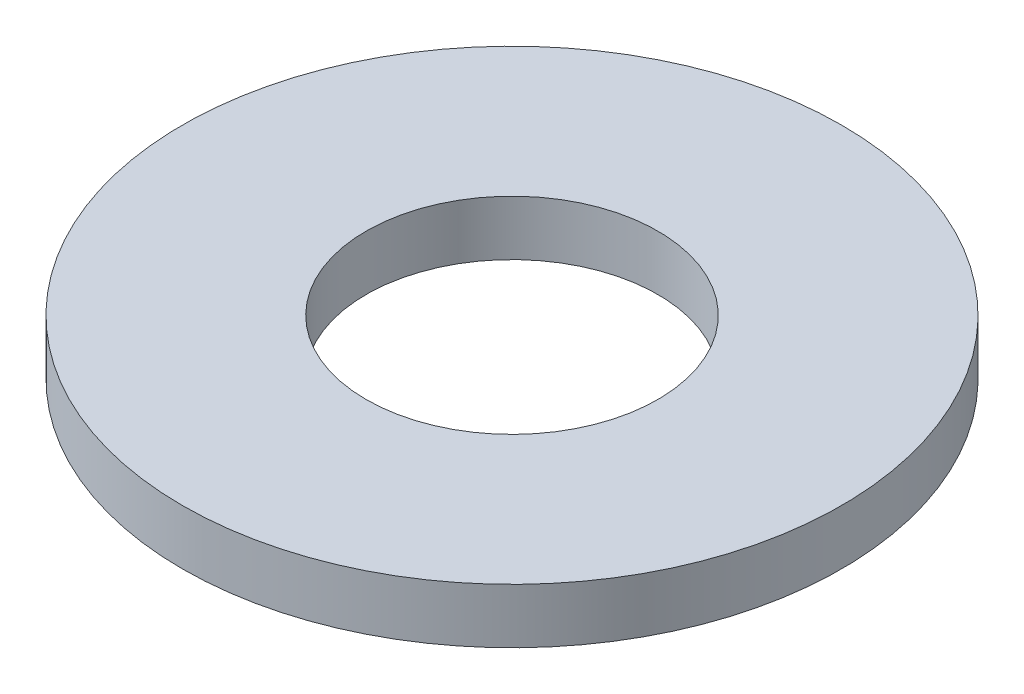
ISO-10303-21;
HEADER;
FILE_DESCRIPTION(('STEP AP214'),'2;1');
FILE_NAME('part.step','',(''),(''),'','','');
FILE_SCHEMA(('AUTOMOTIVE_DESIGN { 1 0 10303 214 1 1 1 1 }'));
ENDSEC;
DATA;
#1=APPLICATION_CONTEXT('core data for automotive mechanical design processes');
#2=APPLICATION_PROTOCOL_DEFINITION('international standard','automotive_design',2000,#1);
#3=PRODUCT_CONTEXT('',#1,'mechanical');
#4=PRODUCT('Part','Part','',(#3));
#5=PRODUCT_RELATED_PRODUCT_CATEGORY('part','',(#4));
#6=PRODUCT_DEFINITION_FORMATION('','',#4);
#7=PRODUCT_DEFINITION_CONTEXT('part definition',#1,'design');
#8=PRODUCT_DEFINITION('design','',#6,#7);
#9=PRODUCT_DEFINITION_SHAPE('','',#8);
#10=(LENGTH_UNIT() NAMED_UNIT(*) SI_UNIT(.MILLI.,.METRE.));
#11=(NAMED_UNIT(*) PLANE_ANGLE_UNIT() SI_UNIT($,.RADIAN.));
#12=(NAMED_UNIT(*) SI_UNIT($,.STERADIAN.) SOLID_ANGLE_UNIT());
#13=UNCERTAINTY_MEASURE_WITH_UNIT(LENGTH_MEASURE(1.E-05),#10,'distance_accuracy_value','');
#14=(GEOMETRIC_REPRESENTATION_CONTEXT(3) GLOBAL_UNCERTAINTY_ASSIGNED_CONTEXT((#13)) GLOBAL_UNIT_ASSIGNED_CONTEXT((#10,
#11,#12)) REPRESENTATION_CONTEXT('',''));
#15=CARTESIAN_POINT('',(0.,0.,0.));
#16=DIRECTION('',(0.,0.,1.));
#17=DIRECTION('',(1.,0.,0.));
#18=AXIS2_PLACEMENT_3D('',#15,#16,#17);
#19=CARTESIAN_POINT('',(0.,0.79375,0.));
#20=DIRECTION('',(0.,1.,0.));
#21=DIRECTION('',(0.,0.,1.));
#22=AXIS2_PLACEMENT_3D('',#19,#20,#21);
#23=PLANE('',#22);
#24=CARTESIAN_POINT('',(0.,0.79375,0.));
#25=DIRECTION('',(0.,1.,0.));
#26=DIRECTION('',(0.,0.,1.));
#27=AXIS2_PLACEMENT_3D('',#24,#25,#26);
#28=CIRCLE('',#27,4.7625);
#29=CARTESIAN_POINT('',(0.,0.79375,4.7625));
#30=VERTEX_POINT('',#29);
#31=EDGE_CURVE('E10',#30,#30,#28,.T.);
#32=ORIENTED_EDGE('',*,*,#31,.T.);
#33=EDGE_LOOP('',(#32));
#34=FACE_BOUND('',#33,.T.);
#35=CARTESIAN_POINT('',(0.,0.79375,0.));
#36=DIRECTION('',(0.,1.,0.));
#37=DIRECTION('',(0.,0.,1.));
#38=AXIS2_PLACEMENT_3D('',#35,#36,#37);
#39=CIRCLE('',#38,2.1082);
#40=CARTESIAN_POINT('',(0.,0.79375,2.1082));
#41=VERTEX_POINT('',#40);
#42=EDGE_CURVE('E50',#41,#41,#39,.T.);
#43=ORIENTED_EDGE('',*,*,#42,.F.);
#44=EDGE_LOOP('',(#43));
#45=FACE_BOUND('',#44,.T.);
#46=ADVANCED_FACE('F37',(#34,#45),#23,.T.);
#47=CARTESIAN_POINT('',(0.,0.,0.));
#48=DIRECTION('',(0.,1.,0.));
#49=DIRECTION('',(0.,0.,1.));
#50=AXIS2_PLACEMENT_3D('',#47,#48,#49);
#51=PLANE('',#50);
#52=CARTESIAN_POINT('',(0.,0.,0.));
#53=DIRECTION('',(0.,1.,0.));
#54=DIRECTION('',(0.,0.,1.));
#55=AXIS2_PLACEMENT_3D('',#52,#53,#54);
#56=CIRCLE('',#55,4.7625);
#57=CARTESIAN_POINT('',(0.,0.,4.7625));
#58=VERTEX_POINT('',#57);
#59=EDGE_CURVE('E41',#58,#58,#56,.T.);
#60=ORIENTED_EDGE('',*,*,#59,.F.);
#61=EDGE_LOOP('',(#60));
#62=FACE_BOUND('',#61,.T.);
#63=CARTESIAN_POINT('',(0.,0.,0.));
#64=DIRECTION('',(0.,1.,0.));
#65=DIRECTION('',(0.,0.,1.));
#66=AXIS2_PLACEMENT_3D('',#63,#64,#65);
#67=CIRCLE('',#66,2.1082);
#68=CARTESIAN_POINT('',(0.,0.,2.1082));
#69=VERTEX_POINT('',#68);
#70=EDGE_CURVE('E52',#69,#69,#67,.T.);
#71=ORIENTED_EDGE('',*,*,#70,.T.);
#72=EDGE_LOOP('',(#71));
#73=FACE_BOUND('',#72,.T.);
#74=ADVANCED_FACE('F64',(#62,#73),#51,.F.);
#75=CARTESIAN_POINT('',(0.,0.79375,0.));
#76=DIRECTION('',(0.,-1.,0.));
#77=DIRECTION('',(0.,0.,-1.));
#78=AXIS2_PLACEMENT_3D('',#75,#76,#77);
#79=CYLINDRICAL_SURFACE('',#78,4.7625);
#80=ORIENTED_EDGE('',*,*,#31,.F.);
#81=EDGE_LOOP('',(#80));
#82=FACE_BOUND('',#81,.T.);
#83=ORIENTED_EDGE('',*,*,#59,.T.);
#84=EDGE_LOOP('',(#83));
#85=FACE_BOUND('',#84,.T.);
#86=ADVANCED_FACE('F39',(#82,#85),#79,.T.);
#87=CARTESIAN_POINT('',(0.,0.79375,0.));
#88=DIRECTION('',(0.,-1.,0.));
#89=DIRECTION('',(0.,0.,-1.));
#90=AXIS2_PLACEMENT_3D('',#87,#88,#89);
#91=CYLINDRICAL_SURFACE('',#90,2.1082);
#92=ORIENTED_EDGE('',*,*,#42,.T.);
#93=EDGE_LOOP('',(#92));
#94=FACE_BOUND('',#93,.T.);
#95=ORIENTED_EDGE('',*,*,#70,.F.);
#96=EDGE_LOOP('',(#95));
#97=FACE_BOUND('',#96,.T.);
#98=ADVANCED_FACE('F60',(#94,#97),#91,.F.);
#99=CLOSED_SHELL('',(#46,#74,#86,#98));
#100=MANIFOLD_SOLID_BREP('B2',#99);
#101=ADVANCED_BREP_SHAPE_REPRESENTATION('',(#18,#100),#14);
#102=SHAPE_DEFINITION_REPRESENTATION(#9,#101);
ENDSEC;
END-ISO-10303-21;
